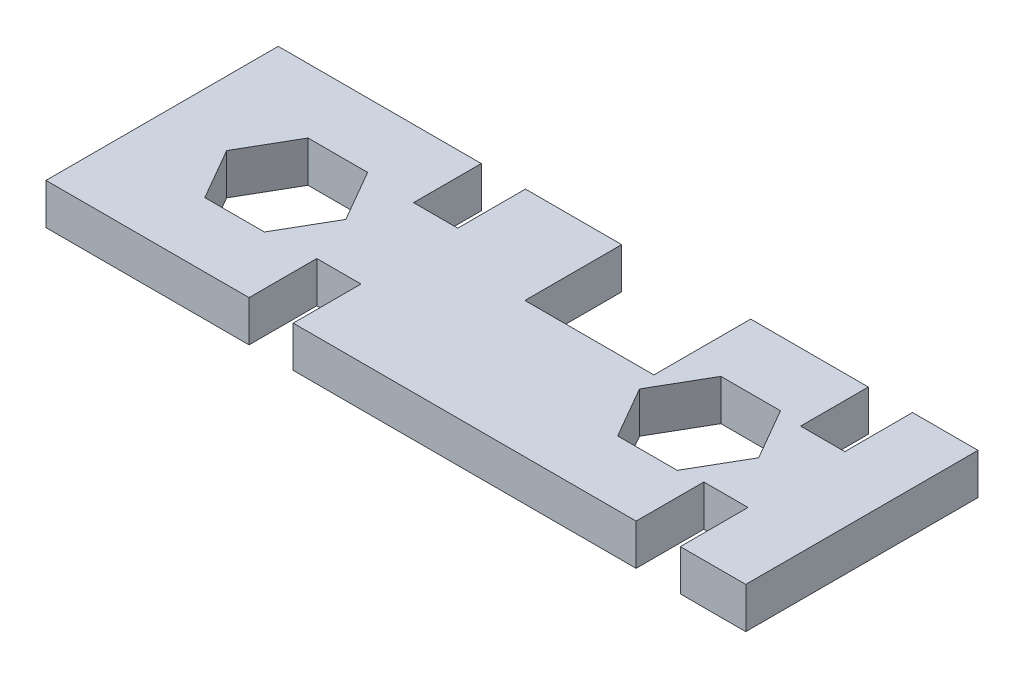
ISO-10303-21;
HEADER;
FILE_DESCRIPTION(('STEP AP214'),'2;1');
FILE_NAME('part.step','',(''),(''),'','','');
FILE_SCHEMA(('AUTOMOTIVE_DESIGN { 1 0 10303 214 1 1 1 1 }'));
ENDSEC;
DATA;
#1=APPLICATION_CONTEXT('core data for automotive mechanical design processes');
#2=APPLICATION_PROTOCOL_DEFINITION('international standard','automotive_design',2000,#1);
#3=PRODUCT_CONTEXT('',#1,'mechanical');
#4=PRODUCT('Part','Part','',(#3));
#5=PRODUCT_RELATED_PRODUCT_CATEGORY('part','',(#4));
#6=PRODUCT_DEFINITION_FORMATION('','',#4);
#7=PRODUCT_DEFINITION_CONTEXT('part definition',#1,'design');
#8=PRODUCT_DEFINITION('design','',#6,#7);
#9=PRODUCT_DEFINITION_SHAPE('','',#8);
#10=(LENGTH_UNIT() NAMED_UNIT(*) SI_UNIT(.MILLI.,.METRE.));
#11=(NAMED_UNIT(*) PLANE_ANGLE_UNIT() SI_UNIT($,.RADIAN.));
#12=(NAMED_UNIT(*) SI_UNIT($,.STERADIAN.) SOLID_ANGLE_UNIT());
#13=UNCERTAINTY_MEASURE_WITH_UNIT(LENGTH_MEASURE(1.E-05),#10,'distance_accuracy_value','');
#14=(GEOMETRIC_REPRESENTATION_CONTEXT(3) GLOBAL_UNCERTAINTY_ASSIGNED_CONTEXT((#13)) GLOBAL_UNIT_ASSIGNED_CONTEXT((#10,
#11,#12)) REPRESENTATION_CONTEXT('',''));
#15=CARTESIAN_POINT('',(0.,0.,0.));
#16=DIRECTION('',(0.,0.,1.));
#17=DIRECTION('',(1.,0.,0.));
#18=AXIS2_PLACEMENT_3D('',#15,#16,#17);
#19=CARTESIAN_POINT('',(-51.237604307034,3.175,-18.));
#20=DIRECTION('',(0.,0.,1.));
#21=DIRECTION('',(1.,0.,0.));
#22=AXIS2_PLACEMENT_3D('',#19,#20,#21);
#23=PLANE('',#22);
#24=DIRECTION('',(-1.,0.,0.));
#25=VECTOR('',#24,1.);
#26=CARTESIAN_POINT('',(-51.237604307034,3.175,-18.));
#27=LINE('',#26,#25);
#28=CARTESIAN_POINT('',(2.00239569296599,3.175,-18.));
#29=VERTEX_POINT('',#28);
#30=CARTESIAN_POINT('',(-12.912395692966,3.175,-18.));
#31=VERTEX_POINT('',#30);
#32=EDGE_CURVE('E631',#29,#31,#27,.T.);
#33=ORIENTED_EDGE('',*,*,#32,.F.);
#34=DIRECTION('',(0.,1.,0.));
#35=VECTOR('',#34,1.);
#36=CARTESIAN_POINT('',(2.00239569296599,-3.175,-18.));
#37=LINE('',#36,#35);
#38=CARTESIAN_POINT('',(2.00239569296599,-3.175,-18.));
#39=VERTEX_POINT('',#38);
#40=EDGE_CURVE('E405',#39,#29,#37,.T.);
#41=ORIENTED_EDGE('',*,*,#40,.F.);
#42=DIRECTION('',(-1.,0.,0.));
#43=VECTOR('',#42,1.);
#44=CARTESIAN_POINT('',(-51.237604307034,-3.175,-18.));
#45=LINE('',#44,#43);
#46=CARTESIAN_POINT('',(-12.912395692966,-3.175,-18.));
#47=VERTEX_POINT('',#46);
#48=EDGE_CURVE('E641',#39,#47,#45,.T.);
#49=ORIENTED_EDGE('',*,*,#48,.T.);
#50=DIRECTION('',(0.,1.,0.));
#51=VECTOR('',#50,1.);
#52=CARTESIAN_POINT('',(-12.912395692966,-3.175,-18.));
#53=LINE('',#52,#51);
#54=EDGE_CURVE('E482',#47,#31,#53,.T.);
#55=ORIENTED_EDGE('',*,*,#54,.T.);
#56=EDGE_LOOP('',(#33,#41,#49,#55));
#57=FACE_BOUND('',#56,.T.);
#58=ADVANCED_FACE('F38',(#57),#23,.F.);
#59=CARTESIAN_POINT('',(40.237604307034,-3.175,-18.));
#60=VERTEX_POINT('',#59);
#61=CARTESIAN_POINT('',(21.997604307034,-3.175,-18.));
#62=VERTEX_POINT('',#61);
#63=EDGE_CURVE('E640',#60,#62,#45,.T.);
#64=ORIENTED_EDGE('',*,*,#63,.T.);
#65=DIRECTION('',(0.,1.,0.));
#66=VECTOR('',#65,1.);
#67=CARTESIAN_POINT('',(21.997604307034,-3.175,-18.));
#68=LINE('',#67,#66);
#69=CARTESIAN_POINT('',(21.997604307034,3.175,-18.));
#70=VERTEX_POINT('',#69);
#71=EDGE_CURVE('E409',#62,#70,#68,.T.);
#72=ORIENTED_EDGE('',*,*,#71,.T.);
#73=CARTESIAN_POINT('',(40.237604307034,3.175,-18.));
#74=VERTEX_POINT('',#73);
#75=EDGE_CURVE('E630',#74,#70,#27,.T.);
#76=ORIENTED_EDGE('',*,*,#75,.F.);
#77=DIRECTION('',(0.,1.,0.));
#78=VECTOR('',#77,1.);
#79=CARTESIAN_POINT('',(40.237604307034,-3.175,-18.));
#80=LINE('',#79,#78);
#81=EDGE_CURVE('E441',#60,#74,#80,.T.);
#82=ORIENTED_EDGE('',*,*,#81,.F.);
#83=EDGE_LOOP('',(#64,#72,#76,#82));
#84=FACE_BOUND('',#83,.T.);
#85=ADVANCED_FACE('F675',(#84),#23,.F.);
#86=CARTESIAN_POINT('',(-19.762395692966,3.175,-18.));
#87=VERTEX_POINT('',#86);
#88=CARTESIAN_POINT('',(-51.237604307034,3.175,-18.));
#89=VERTEX_POINT('',#88);
#90=EDGE_CURVE('E625',#87,#89,#27,.T.);
#91=ORIENTED_EDGE('',*,*,#90,.F.);
#92=DIRECTION('',(0.,1.,0.));
#93=VECTOR('',#92,1.);
#94=CARTESIAN_POINT('',(-19.762395692966,-3.175,-18.));
#95=LINE('',#94,#93);
#96=CARTESIAN_POINT('',(-19.762395692966,-3.175,-18.));
#97=VERTEX_POINT('',#96);
#98=EDGE_CURVE('E478',#97,#87,#95,.T.);
#99=ORIENTED_EDGE('',*,*,#98,.F.);
#100=CARTESIAN_POINT('',(-51.237604307034,-3.175,-18.));
#101=VERTEX_POINT('',#100);
#102=EDGE_CURVE('E637',#97,#101,#45,.T.);
#103=ORIENTED_EDGE('',*,*,#102,.T.);
#104=DIRECTION('',(0.,-1.,0.));
#105=VECTOR('',#104,1.);
#106=CARTESIAN_POINT('',(-51.237604307034,3.175,-18.));
#107=LINE('',#106,#105);
#108=EDGE_CURVE('E47',#89,#101,#107,.T.);
#109=ORIENTED_EDGE('',*,*,#108,.F.);
#110=EDGE_LOOP('',(#91,#99,#103,#109));
#111=FACE_BOUND('',#110,.T.);
#112=ADVANCED_FACE('F697',(#111),#23,.F.);
#113=CARTESIAN_POINT('',(0.,3.175,0.));
#114=DIRECTION('',(0.,1.,0.));
#115=DIRECTION('',(0.,0.,1.));
#116=AXIS2_PLACEMENT_3D('',#113,#114,#115);
#117=PLANE('',#116);
#118=DIRECTION('',(-1.,0.,0.));
#119=VECTOR('',#118,1.);
#120=CARTESIAN_POINT('',(-51.237604307034,3.175,18.));
#121=LINE('',#120,#119);
#122=CARTESIAN_POINT('',(-19.762395692966,3.175,18.));
#123=VERTEX_POINT('',#122);
#124=CARTESIAN_POINT('',(-51.237604307034,3.175,18.));
#125=VERTEX_POINT('',#124);
#126=EDGE_CURVE('E298',#123,#125,#121,.T.);
#127=ORIENTED_EDGE('',*,*,#126,.F.);
#128=DIRECTION('',(0.,0.,1.));
#129=VECTOR('',#128,1.);
#130=CARTESIAN_POINT('',(-19.762395692966,3.175,18.));
#131=LINE('',#130,#129);
#132=CARTESIAN_POINT('',(-19.762395692966,3.175,7.50000000000002));
#133=VERTEX_POINT('',#132);
#134=EDGE_CURVE('E301',#133,#123,#131,.T.);
#135=ORIENTED_EDGE('',*,*,#134,.F.);
#136=DIRECTION('',(-1.,0.,0.));
#137=VECTOR('',#136,1.);
#138=CARTESIAN_POINT('',(-19.762395692966,3.175,7.50000000000002));
#139=LINE('',#138,#137);
#140=CARTESIAN_POINT('',(-12.912395692966,3.175,7.50000000000002));
#141=VERTEX_POINT('',#140);
#142=EDGE_CURVE('E350',#141,#133,#139,.T.);
#143=ORIENTED_EDGE('',*,*,#142,.F.);
#144=DIRECTION('',(0.,0.,-1.));
#145=VECTOR('',#144,1.);
#146=CARTESIAN_POINT('',(-12.912395692966,3.175,18.));
#147=LINE('',#146,#145);
#148=CARTESIAN_POINT('',(-12.912395692966,3.175,18.));
#149=VERTEX_POINT('',#148);
#150=EDGE_CURVE('E346',#149,#141,#147,.T.);
#151=ORIENTED_EDGE('',*,*,#150,.F.);
#152=DIRECTION('',(-1.,0.,0.));
#153=VECTOR('',#152,1.);
#154=CARTESIAN_POINT('',(-12.912395692966,3.175,18.));
#155=LINE('',#154,#153);
#156=CARTESIAN_POINT('',(40.237604307034,3.175,18.));
#157=VERTEX_POINT('',#156);
#158=EDGE_CURVE('E342',#157,#149,#155,.T.);
#159=ORIENTED_EDGE('',*,*,#158,.F.);
#160=DIRECTION('',(0.,0.,1.));
#161=VECTOR('',#160,1.);
#162=CARTESIAN_POINT('',(40.237604307034,3.175,18.));
#163=LINE('',#162,#161);
#164=CARTESIAN_POINT('',(40.237604307034,3.175,7.50000000000002));
#165=VERTEX_POINT('',#164);
#166=EDGE_CURVE('E338',#165,#157,#163,.T.);
#167=ORIENTED_EDGE('',*,*,#166,.F.);
#168=DIRECTION('',(-1.,0.,0.));
#169=VECTOR('',#168,1.);
#170=CARTESIAN_POINT('',(40.237604307034,3.175,7.50000000000002));
#171=LINE('',#170,#169);
#172=CARTESIAN_POINT('',(47.087604307034,3.175,7.50000000000002));
#173=VERTEX_POINT('',#172);
#174=EDGE_CURVE('E334',#173,#165,#171,.T.);
#175=ORIENTED_EDGE('',*,*,#174,.F.);
#176=DIRECTION('',(0.,0.,-1.));
#177=VECTOR('',#176,1.);
#178=CARTESIAN_POINT('',(47.087604307034,3.175,18.));
#179=LINE('',#178,#177);
#180=CARTESIAN_POINT('',(47.087604307034,3.175,18.));
#181=VERTEX_POINT('',#180);
#182=EDGE_CURVE('E331',#181,#173,#179,.T.);
#183=ORIENTED_EDGE('',*,*,#182,.F.);
#184=DIRECTION('',(-1.,0.,0.));
#185=VECTOR('',#184,1.);
#186=CARTESIAN_POINT('',(47.087604307034,3.175,18.));
#187=LINE('',#186,#185);
#188=CARTESIAN_POINT('',(57.237604307034,3.175,18.));
#189=VERTEX_POINT('',#188);
#190=EDGE_CURVE('E274',#189,#181,#187,.T.);
#191=ORIENTED_EDGE('',*,*,#190,.F.);
#192=DIRECTION('',(0.,0.,-1.));
#193=VECTOR('',#192,1.);
#194=CARTESIAN_POINT('',(57.237604307034,3.175,-18.));
#195=LINE('',#194,#193);
#196=CARTESIAN_POINT('',(57.237604307034,3.175,-18.));
#197=VERTEX_POINT('',#196);
#198=EDGE_CURVE('E621',#189,#197,#195,.T.);
#199=ORIENTED_EDGE('',*,*,#198,.T.);
#200=CARTESIAN_POINT('',(47.087604307034,3.175,-18.));
#201=VERTEX_POINT('',#200);
#202=EDGE_CURVE('E626',#197,#201,#27,.T.);
#203=ORIENTED_EDGE('',*,*,#202,.T.);
#204=DIRECTION('',(0.,0.,-1.));
#205=VECTOR('',#204,1.);
#206=CARTESIAN_POINT('',(47.087604307034,3.175,-18.));
#207=LINE('',#206,#205);
#208=CARTESIAN_POINT('',(47.087604307034,3.175,-7.49999999999998));
#209=VERTEX_POINT('',#208);
#210=EDGE_CURVE('E423',#209,#201,#207,.T.);
#211=ORIENTED_EDGE('',*,*,#210,.F.);
#212=DIRECTION('',(1.,0.,0.));
#213=VECTOR('',#212,1.);
#214=CARTESIAN_POINT('',(40.237604307034,3.175,-7.49999999999998));
#215=LINE('',#214,#213);
#216=CARTESIAN_POINT('',(40.237604307034,3.175,-7.49999999999998));
#217=VERTEX_POINT('',#216);
#218=EDGE_CURVE('E435',#217,#209,#215,.T.);
#219=ORIENTED_EDGE('',*,*,#218,.F.);
#220=DIRECTION('',(0.,0.,1.));
#221=VECTOR('',#220,1.);
#222=CARTESIAN_POINT('',(40.237604307034,3.175,-18.));
#223=LINE('',#222,#221);
#224=EDGE_CURVE('E408',#74,#217,#223,.T.);
#225=ORIENTED_EDGE('',*,*,#224,.F.);
#226=ORIENTED_EDGE('',*,*,#75,.T.);
#227=DIRECTION('',(0.,0.,-1.));
#228=VECTOR('',#227,1.);
#229=CARTESIAN_POINT('',(21.997604307034,3.175,-18.));
#230=LINE('',#229,#228);
#231=CARTESIAN_POINT('',(21.997604307034,3.175,-2.99999999999998));
#232=VERTEX_POINT('',#231);
#233=EDGE_CURVE('E389',#232,#70,#230,.T.);
#234=ORIENTED_EDGE('',*,*,#233,.F.);
#235=DIRECTION('',(1.,0.,0.));
#236=VECTOR('',#235,1.);
#237=CARTESIAN_POINT('',(2.002395692966,3.175,-2.99999999999998));
#238=LINE('',#237,#236);
#239=CARTESIAN_POINT('',(2.002395692966,3.175,-2.99999999999998));
#240=VERTEX_POINT('',#239);
#241=EDGE_CURVE('E399',#240,#232,#238,.T.);
#242=ORIENTED_EDGE('',*,*,#241,.F.);
#243=DIRECTION('',(0.,0.,1.));
#244=VECTOR('',#243,1.);
#245=CARTESIAN_POINT('',(2.00239569296599,3.175,-18.));
#246=LINE('',#245,#244);
#247=EDGE_CURVE('E361',#29,#240,#246,.T.);
#248=ORIENTED_EDGE('',*,*,#247,.F.);
#249=ORIENTED_EDGE('',*,*,#32,.T.);
#250=DIRECTION('',(0.,0.,-1.));
#251=VECTOR('',#250,1.);
#252=CARTESIAN_POINT('',(-12.912395692966,3.175,-18.));
#253=LINE('',#252,#251);
#254=CARTESIAN_POINT('',(-12.912395692966,3.175,-7.49999999999998));
#255=VERTEX_POINT('',#254);
#256=EDGE_CURVE('E459',#255,#31,#253,.T.);
#257=ORIENTED_EDGE('',*,*,#256,.F.);
#258=DIRECTION('',(1.,0.,0.));
#259=VECTOR('',#258,1.);
#260=CARTESIAN_POINT('',(-19.762395692966,3.175,-7.49999999999998));
#261=LINE('',#260,#259);
#262=CARTESIAN_POINT('',(-19.762395692966,3.175,-7.49999999999998));
#263=VERTEX_POINT('',#262);
#264=EDGE_CURVE('E471',#263,#255,#261,.T.);
#265=ORIENTED_EDGE('',*,*,#264,.F.);
#266=DIRECTION('',(0.,0.,1.));
#267=VECTOR('',#266,1.);
#268=CARTESIAN_POINT('',(-19.762395692966,3.175,-18.));
#269=LINE('',#268,#267);
#270=EDGE_CURVE('E444',#87,#263,#269,.T.);
#271=ORIENTED_EDGE('',*,*,#270,.F.);
#272=ORIENTED_EDGE('',*,*,#90,.T.);
#273=DIRECTION('',(0.,0.,1.));
#274=VECTOR('',#273,1.);
#275=CARTESIAN_POINT('',(-51.237604307034,3.175,-18.));
#276=LINE('',#275,#274);
#277=EDGE_CURVE('E617',#89,#125,#276,.T.);
#278=ORIENTED_EDGE('',*,*,#277,.T.);
#279=EDGE_LOOP('',(#127,#135,#143,#151,#159,#167,#175,#183,#191,#199,#203,#211,#219,#225,#226,
#234,#242,#248,#249,#257,#265,#271,#272,#278));
#280=FACE_BOUND('',#279,.T.);
#281=DIRECTION('',(-0.499999999999999,0.,-0.866025403784439));
#282=VECTOR('',#281,1.);
#283=CARTESIAN_POINT('',(-22.762395692966,3.175,0.));
#284=LINE('',#283,#282);
#285=CARTESIAN_POINT('',(-22.762395692966,3.175,0.));
#286=VERTEX_POINT('',#285);
#287=CARTESIAN_POINT('',(-27.381197846483,3.175,-7.99999999999998));
#288=VERTEX_POINT('',#287);
#289=EDGE_CURVE('E557',#286,#288,#284,.T.);
#290=ORIENTED_EDGE('',*,*,#289,.F.);
#291=DIRECTION('',(0.5,0.,-0.866025403784439));
#292=VECTOR('',#291,1.);
#293=CARTESIAN_POINT('',(-27.381197846483,3.175,8.00000000000002));
#294=LINE('',#293,#292);
#295=CARTESIAN_POINT('',(-27.381197846483,3.175,8.00000000000002));
#296=VERTEX_POINT('',#295);
#297=EDGE_CURVE('E554',#296,#286,#294,.T.);
#298=ORIENTED_EDGE('',*,*,#297,.F.);
#299=DIRECTION('',(1.,0.,0.));
#300=VECTOR('',#299,1.);
#301=CARTESIAN_POINT('',(-36.618802153517,3.175,8.00000000000002));
#302=LINE('',#301,#300);
#303=CARTESIAN_POINT('',(-36.618802153517,3.175,8.00000000000002));
#304=VERTEX_POINT('',#303);
#305=EDGE_CURVE('E571',#304,#296,#302,.T.);
#306=ORIENTED_EDGE('',*,*,#305,.F.);
#307=DIRECTION('',(0.5,0.,0.866025403784438));
#308=VECTOR('',#307,1.);
#309=CARTESIAN_POINT('',(-41.237604307034,3.175,0.));
#310=LINE('',#309,#308);
#311=CARTESIAN_POINT('',(-41.237604307034,3.175,0.));
#312=VERTEX_POINT('',#311);
#313=EDGE_CURVE('E567',#312,#304,#310,.T.);
#314=ORIENTED_EDGE('',*,*,#313,.F.);
#315=DIRECTION('',(-0.5,0.,0.866025403784438));
#316=VECTOR('',#315,1.);
#317=CARTESIAN_POINT('',(-36.618802153517,3.175,-7.99999999999998));
#318=LINE('',#317,#316);
#319=CARTESIAN_POINT('',(-36.618802153517,3.175,-7.99999999999998));
#320=VERTEX_POINT('',#319);
#321=EDGE_CURVE('E564',#320,#312,#318,.T.);
#322=ORIENTED_EDGE('',*,*,#321,.F.);
#323=DIRECTION('',(-1.,0.,0.));
#324=VECTOR('',#323,1.);
#325=CARTESIAN_POINT('',(-27.381197846483,3.175,-7.99999999999998));
#326=LINE('',#325,#324);
#327=EDGE_CURVE('E561',#288,#320,#326,.T.);
#328=ORIENTED_EDGE('',*,*,#327,.F.);
#329=EDGE_LOOP('',(#290,#298,#306,#314,#322,#328));
#330=FACE_BOUND('',#329,.T.);
#331=DIRECTION('',(-0.5,0.,-0.866025403784439));
#332=VECTOR('',#331,1.);
#333=CARTESIAN_POINT('',(41.237604307034,3.175,0.));
#334=LINE('',#333,#332);
#335=CARTESIAN_POINT('',(41.237604307034,3.175,0.));
#336=VERTEX_POINT('',#335);
#337=CARTESIAN_POINT('',(36.618802153517,3.175,-7.99999999999999));
#338=VERTEX_POINT('',#337);
#339=EDGE_CURVE('E494',#336,#338,#334,.T.);
#340=ORIENTED_EDGE('',*,*,#339,.F.);
#341=DIRECTION('',(0.5,0.,-0.866025403784439));
#342=VECTOR('',#341,1.);
#343=CARTESIAN_POINT('',(36.618802153517,3.175,8.00000000000001));
#344=LINE('',#343,#342);
#345=CARTESIAN_POINT('',(36.618802153517,3.175,8.00000000000001));
#346=VERTEX_POINT('',#345);
#347=EDGE_CURVE('E491',#346,#336,#344,.T.);
#348=ORIENTED_EDGE('',*,*,#347,.F.);
#349=DIRECTION('',(1.,0.,0.));
#350=VECTOR('',#349,1.);
#351=CARTESIAN_POINT('',(27.381197846483,3.175,8.00000000000001));
#352=LINE('',#351,#350);
#353=CARTESIAN_POINT('',(27.381197846483,3.175,8.00000000000001));
#354=VERTEX_POINT('',#353);
#355=EDGE_CURVE('E508',#354,#346,#352,.T.);
#356=ORIENTED_EDGE('',*,*,#355,.F.);
#357=DIRECTION('',(0.5,0.,0.866025403784438));
#358=VECTOR('',#357,1.);
#359=CARTESIAN_POINT('',(22.762395692966,3.175,0.));
#360=LINE('',#359,#358);
#361=CARTESIAN_POINT('',(22.762395692966,3.175,0.));
#362=VERTEX_POINT('',#361);
#363=EDGE_CURVE('E504',#362,#354,#360,.T.);
#364=ORIENTED_EDGE('',*,*,#363,.F.);
#365=DIRECTION('',(-0.5,0.,0.866025403784438));
#366=VECTOR('',#365,1.);
#367=CARTESIAN_POINT('',(27.381197846483,3.175,-7.99999999999999));
#368=LINE('',#367,#366);
#369=CARTESIAN_POINT('',(27.381197846483,3.175,-7.99999999999999));
#370=VERTEX_POINT('',#369);
#371=EDGE_CURVE('E501',#370,#362,#368,.T.);
#372=ORIENTED_EDGE('',*,*,#371,.F.);
#373=DIRECTION('',(-1.,0.,0.));
#374=VECTOR('',#373,1.);
#375=CARTESIAN_POINT('',(36.618802153517,3.175,-7.99999999999999));
#376=LINE('',#375,#374);
#377=EDGE_CURVE('E498',#338,#370,#376,.T.);
#378=ORIENTED_EDGE('',*,*,#377,.F.);
#379=EDGE_LOOP('',(#340,#348,#356,#364,#372,#378));
#380=FACE_BOUND('',#379,.T.);
#381=ADVANCED_FACE('F657',(#280,#330,#380),#117,.T.);
#382=CARTESIAN_POINT('',(0.,-3.175,0.));
#383=DIRECTION('',(0.,1.,0.));
#384=DIRECTION('',(0.,0.,1.));
#385=AXIS2_PLACEMENT_3D('',#382,#383,#384);
#386=PLANE('',#385);
#387=DIRECTION('',(0.,0.,1.));
#388=VECTOR('',#387,1.);
#389=CARTESIAN_POINT('',(-19.762395692966,-3.175,18.));
#390=LINE('',#389,#388);
#391=CARTESIAN_POINT('',(-19.762395692966,-3.175,7.50000000000002));
#392=VERTEX_POINT('',#391);
#393=CARTESIAN_POINT('',(-19.762395692966,-3.175,18.));
#394=VERTEX_POINT('',#393);
#395=EDGE_CURVE('E322',#392,#394,#390,.T.);
#396=ORIENTED_EDGE('',*,*,#395,.T.);
#397=DIRECTION('',(-1.,0.,0.));
#398=VECTOR('',#397,1.);
#399=CARTESIAN_POINT('',(-51.237604307034,-3.175,18.));
#400=LINE('',#399,#398);
#401=CARTESIAN_POINT('',(-51.237604307034,-3.175,18.));
#402=VERTEX_POINT('',#401);
#403=EDGE_CURVE('E325',#394,#402,#400,.T.);
#404=ORIENTED_EDGE('',*,*,#403,.T.);
#405=DIRECTION('',(0.,0.,1.));
#406=VECTOR('',#405,1.);
#407=CARTESIAN_POINT('',(-51.237604307034,-3.175,-18.));
#408=LINE('',#407,#406);
#409=EDGE_CURVE('E616',#101,#402,#408,.T.);
#410=ORIENTED_EDGE('',*,*,#409,.F.);
#411=ORIENTED_EDGE('',*,*,#102,.F.);
#412=DIRECTION('',(0.,0.,1.));
#413=VECTOR('',#412,1.);
#414=CARTESIAN_POINT('',(-19.762395692966,-3.175,-18.));
#415=LINE('',#414,#413);
#416=CARTESIAN_POINT('',(-19.762395692966,-3.175,-7.49999999999998));
#417=VERTEX_POINT('',#416);
#418=EDGE_CURVE('E454',#97,#417,#415,.T.);
#419=ORIENTED_EDGE('',*,*,#418,.T.);
#420=DIRECTION('',(1.,0.,0.));
#421=VECTOR('',#420,1.);
#422=CARTESIAN_POINT('',(-19.762395692966,-3.175,-7.49999999999998));
#423=LINE('',#422,#421);
#424=CARTESIAN_POINT('',(-12.912395692966,-3.175,-7.49999999999998));
#425=VERTEX_POINT('',#424);
#426=EDGE_CURVE('E458',#417,#425,#423,.T.);
#427=ORIENTED_EDGE('',*,*,#426,.T.);
#428=DIRECTION('',(0.,0.,-1.));
#429=VECTOR('',#428,1.);
#430=CARTESIAN_POINT('',(-12.912395692966,-3.175,-18.));
#431=LINE('',#430,#429);
#432=EDGE_CURVE('E463',#425,#47,#431,.T.);
#433=ORIENTED_EDGE('',*,*,#432,.T.);
#434=ORIENTED_EDGE('',*,*,#48,.F.);
#435=DIRECTION('',(0.,0.,1.));
#436=VECTOR('',#435,1.);
#437=CARTESIAN_POINT('',(2.00239569296599,-3.175,-18.));
#438=LINE('',#437,#436);
#439=CARTESIAN_POINT('',(2.002395692966,-3.175,-2.99999999999998));
#440=VERTEX_POINT('',#439);
#441=EDGE_CURVE('E384',#39,#440,#438,.T.);
#442=ORIENTED_EDGE('',*,*,#441,.T.);
#443=DIRECTION('',(1.,0.,0.));
#444=VECTOR('',#443,1.);
#445=CARTESIAN_POINT('',(2.002395692966,-3.175,-2.99999999999998));
#446=LINE('',#445,#444);
#447=CARTESIAN_POINT('',(21.997604307034,-3.175,-2.99999999999998));
#448=VERTEX_POINT('',#447);
#449=EDGE_CURVE('E388',#440,#448,#446,.T.);
#450=ORIENTED_EDGE('',*,*,#449,.T.);
#451=DIRECTION('',(0.,0.,-1.));
#452=VECTOR('',#451,1.);
#453=CARTESIAN_POINT('',(21.997604307034,-3.175,-18.));
#454=LINE('',#453,#452);
#455=EDGE_CURVE('E62',#448,#62,#454,.T.);
#456=ORIENTED_EDGE('',*,*,#455,.T.);
#457=ORIENTED_EDGE('',*,*,#63,.F.);
#458=DIRECTION('',(0.,0.,1.));
#459=VECTOR('',#458,1.);
#460=CARTESIAN_POINT('',(40.237604307034,-3.175,-18.));
#461=LINE('',#460,#459);
#462=CARTESIAN_POINT('',(40.237604307034,-3.175,-7.49999999999998));
#463=VERTEX_POINT('',#462);
#464=EDGE_CURVE('E418',#60,#463,#461,.T.);
#465=ORIENTED_EDGE('',*,*,#464,.T.);
#466=DIRECTION('',(1.,0.,0.));
#467=VECTOR('',#466,1.);
#468=CARTESIAN_POINT('',(40.237604307034,-3.175,-7.49999999999998));
#469=LINE('',#468,#467);
#470=CARTESIAN_POINT('',(47.087604307034,-3.175,-7.49999999999998));
#471=VERTEX_POINT('',#470);
#472=EDGE_CURVE('E422',#463,#471,#469,.T.);
#473=ORIENTED_EDGE('',*,*,#472,.T.);
#474=DIRECTION('',(0.,0.,-1.));
#475=VECTOR('',#474,1.);
#476=CARTESIAN_POINT('',(47.087604307034,-3.175,-18.));
#477=LINE('',#476,#475);
#478=CARTESIAN_POINT('',(47.087604307034,-3.175,-18.));
#479=VERTEX_POINT('',#478);
#480=EDGE_CURVE('E427',#471,#479,#477,.T.);
#481=ORIENTED_EDGE('',*,*,#480,.T.);
#482=CARTESIAN_POINT('',(57.237604307034,-3.175,-18.));
#483=VERTEX_POINT('',#482);
#484=EDGE_CURVE('E622',#483,#479,#45,.T.);
#485=ORIENTED_EDGE('',*,*,#484,.F.);
#486=DIRECTION('',(0.,0.,-1.));
#487=VECTOR('',#486,1.);
#488=CARTESIAN_POINT('',(57.237604307034,-3.175,-18.));
#489=LINE('',#488,#487);
#490=CARTESIAN_POINT('',(57.237604307034,-3.175,18.));
#491=VERTEX_POINT('',#490);
#492=EDGE_CURVE('E296',#491,#483,#489,.T.);
#493=ORIENTED_EDGE('',*,*,#492,.F.);
#494=DIRECTION('',(-1.,0.,0.));
#495=VECTOR('',#494,1.);
#496=CARTESIAN_POINT('',(47.087604307034,-3.175,18.));
#497=LINE('',#496,#495);
#498=CARTESIAN_POINT('',(47.087604307034,-3.175,18.));
#499=VERTEX_POINT('',#498);
#500=EDGE_CURVE('E54',#491,#499,#497,.T.);
#501=ORIENTED_EDGE('',*,*,#500,.T.);
#502=DIRECTION('',(0.,0.,-1.));
#503=VECTOR('',#502,1.);
#504=CARTESIAN_POINT('',(47.087604307034,-3.175,18.));
#505=LINE('',#504,#503);
#506=CARTESIAN_POINT('',(47.087604307034,-3.175,7.50000000000002));
#507=VERTEX_POINT('',#506);
#508=EDGE_CURVE('E283',#499,#507,#505,.T.);
#509=ORIENTED_EDGE('',*,*,#508,.T.);
#510=DIRECTION('',(-1.,0.,0.));
#511=VECTOR('',#510,1.);
#512=CARTESIAN_POINT('',(40.237604307034,-3.175,7.50000000000002));
#513=LINE('',#512,#511);
#514=CARTESIAN_POINT('',(40.237604307034,-3.175,7.50000000000002));
#515=VERTEX_POINT('',#514);
#516=EDGE_CURVE('E289',#507,#515,#513,.T.);
#517=ORIENTED_EDGE('',*,*,#516,.T.);
#518=DIRECTION('',(0.,0.,1.));
#519=VECTOR('',#518,1.);
#520=CARTESIAN_POINT('',(40.237604307034,-3.175,18.));
#521=LINE('',#520,#519);
#522=CARTESIAN_POINT('',(40.237604307034,-3.175,18.));
#523=VERTEX_POINT('',#522);
#524=EDGE_CURVE('E306',#515,#523,#521,.T.);
#525=ORIENTED_EDGE('',*,*,#524,.T.);
#526=DIRECTION('',(-1.,0.,0.));
#527=VECTOR('',#526,1.);
#528=CARTESIAN_POINT('',(-12.912395692966,-3.175,18.));
#529=LINE('',#528,#527);
#530=CARTESIAN_POINT('',(-12.912395692966,-3.175,18.));
#531=VERTEX_POINT('',#530);
#532=EDGE_CURVE('E310',#523,#531,#529,.T.);
#533=ORIENTED_EDGE('',*,*,#532,.T.);
#534=DIRECTION('',(0.,0.,-1.));
#535=VECTOR('',#534,1.);
#536=CARTESIAN_POINT('',(-12.912395692966,-3.175,18.));
#537=LINE('',#536,#535);
#538=CARTESIAN_POINT('',(-12.912395692966,-3.175,7.50000000000002));
#539=VERTEX_POINT('',#538);
#540=EDGE_CURVE('E314',#531,#539,#537,.T.);
#541=ORIENTED_EDGE('',*,*,#540,.T.);
#542=DIRECTION('',(-1.,0.,0.));
#543=VECTOR('',#542,1.);
#544=CARTESIAN_POINT('',(-19.762395692966,-3.175,7.50000000000002));
#545=LINE('',#544,#543);
#546=EDGE_CURVE('E318',#539,#392,#545,.T.);
#547=ORIENTED_EDGE('',*,*,#546,.T.);
#548=EDGE_LOOP('',(#396,#404,#410,#411,#419,#427,#433,#434,#442,#450,#456,#457,#465,#473,#481,
#485,#493,#501,#509,#517,#525,#533,#541,#547));
#549=FACE_BOUND('',#548,.T.);
#550=DIRECTION('',(0.5,0.,-0.866025403784439));
#551=VECTOR('',#550,1.);
#552=CARTESIAN_POINT('',(-27.381197846483,-3.175,8.00000000000002));
#553=LINE('',#552,#551);
#554=CARTESIAN_POINT('',(-27.381197846483,-3.175,8.00000000000002));
#555=VERTEX_POINT('',#554);
#556=CARTESIAN_POINT('',(-22.762395692966,-3.175,0.));
#557=VERTEX_POINT('',#556);
#558=EDGE_CURVE('E553',#555,#557,#553,.T.);
#559=ORIENTED_EDGE('',*,*,#558,.T.);
#560=DIRECTION('',(-0.499999999999999,0.,-0.866025403784439));
#561=VECTOR('',#560,1.);
#562=CARTESIAN_POINT('',(-22.762395692966,-3.175,0.));
#563=LINE('',#562,#561);
#564=CARTESIAN_POINT('',(-27.381197846483,-3.175,-7.99999999999998));
#565=VERTEX_POINT('',#564);
#566=EDGE_CURVE('E578',#557,#565,#563,.T.);
#567=ORIENTED_EDGE('',*,*,#566,.T.);
#568=DIRECTION('',(-1.,0.,0.));
#569=VECTOR('',#568,1.);
#570=CARTESIAN_POINT('',(-27.381197846483,-3.175,-7.99999999999998));
#571=LINE('',#570,#569);
#572=CARTESIAN_POINT('',(-36.618802153517,-3.175,-7.99999999999998));
#573=VERTEX_POINT('',#572);
#574=EDGE_CURVE('E582',#565,#573,#571,.T.);
#575=ORIENTED_EDGE('',*,*,#574,.T.);
#576=DIRECTION('',(-0.5,0.,0.866025403784438));
#577=VECTOR('',#576,1.);
#578=CARTESIAN_POINT('',(-36.618802153517,-3.175,-7.99999999999998));
#579=LINE('',#578,#577);
#580=CARTESIAN_POINT('',(-41.237604307034,-3.175,0.));
#581=VERTEX_POINT('',#580);
#582=EDGE_CURVE('E586',#573,#581,#579,.T.);
#583=ORIENTED_EDGE('',*,*,#582,.T.);
#584=DIRECTION('',(0.5,0.,0.866025403784438));
#585=VECTOR('',#584,1.);
#586=CARTESIAN_POINT('',(-41.237604307034,-3.175,0.));
#587=LINE('',#586,#585);
#588=CARTESIAN_POINT('',(-36.618802153517,-3.175,8.00000000000002));
#589=VERTEX_POINT('',#588);
#590=EDGE_CURVE('E590',#581,#589,#587,.T.);
#591=ORIENTED_EDGE('',*,*,#590,.T.);
#592=DIRECTION('',(1.,0.,0.));
#593=VECTOR('',#592,1.);
#594=CARTESIAN_POINT('',(-36.618802153517,-3.175,8.00000000000002));
#595=LINE('',#594,#593);
#596=EDGE_CURVE('E558',#589,#555,#595,.T.);
#597=ORIENTED_EDGE('',*,*,#596,.T.);
#598=EDGE_LOOP('',(#559,#567,#575,#583,#591,#597));
#599=FACE_BOUND('',#598,.T.);
#600=DIRECTION('',(0.5,0.,-0.866025403784439));
#601=VECTOR('',#600,1.);
#602=CARTESIAN_POINT('',(36.618802153517,-3.175,8.00000000000001));
#603=LINE('',#602,#601);
#604=CARTESIAN_POINT('',(36.618802153517,-3.175,8.00000000000001));
#605=VERTEX_POINT('',#604);
#606=CARTESIAN_POINT('',(41.237604307034,-3.175,0.));
#607=VERTEX_POINT('',#606);
#608=EDGE_CURVE('E481',#605,#607,#603,.T.);
#609=ORIENTED_EDGE('',*,*,#608,.T.);
#610=DIRECTION('',(-0.5,0.,-0.866025403784439));
#611=VECTOR('',#610,1.);
#612=CARTESIAN_POINT('',(41.237604307034,-3.175,0.));
#613=LINE('',#612,#611);
#614=CARTESIAN_POINT('',(36.618802153517,-3.175,-7.99999999999999));
#615=VERTEX_POINT('',#614);
#616=EDGE_CURVE('E515',#607,#615,#613,.T.);
#617=ORIENTED_EDGE('',*,*,#616,.T.);
#618=DIRECTION('',(-1.,0.,0.));
#619=VECTOR('',#618,1.);
#620=CARTESIAN_POINT('',(36.618802153517,-3.175,-7.99999999999999));
#621=LINE('',#620,#619);
#622=CARTESIAN_POINT('',(27.381197846483,-3.175,-7.99999999999999));
#623=VERTEX_POINT('',#622);
#624=EDGE_CURVE('E519',#615,#623,#621,.T.);
#625=ORIENTED_EDGE('',*,*,#624,.T.);
#626=DIRECTION('',(-0.5,0.,0.866025403784438));
#627=VECTOR('',#626,1.);
#628=CARTESIAN_POINT('',(27.381197846483,-3.175,-7.99999999999999));
#629=LINE('',#628,#627);
#630=CARTESIAN_POINT('',(22.762395692966,-3.175,0.));
#631=VERTEX_POINT('',#630);
#632=EDGE_CURVE('E523',#623,#631,#629,.T.);
#633=ORIENTED_EDGE('',*,*,#632,.T.);
#634=DIRECTION('',(0.5,0.,0.866025403784438));
#635=VECTOR('',#634,1.);
#636=CARTESIAN_POINT('',(22.762395692966,-3.175,0.));
#637=LINE('',#636,#635);
#638=CARTESIAN_POINT('',(27.381197846483,-3.175,8.00000000000001));
#639=VERTEX_POINT('',#638);
#640=EDGE_CURVE('E527',#631,#639,#637,.T.);
#641=ORIENTED_EDGE('',*,*,#640,.T.);
#642=DIRECTION('',(1.,0.,0.));
#643=VECTOR('',#642,1.);
#644=CARTESIAN_POINT('',(27.381197846483,-3.175,8.00000000000001));
#645=LINE('',#644,#643);
#646=EDGE_CURVE('E495',#639,#605,#645,.T.);
#647=ORIENTED_EDGE('',*,*,#646,.T.);
#648=EDGE_LOOP('',(#609,#617,#625,#633,#641,#647));
#649=FACE_BOUND('',#648,.T.);
#650=ADVANCED_FACE('F293',(#549,#599,#649),#386,.F.);
#651=CARTESIAN_POINT('',(-51.237604307034,3.175,-18.));
#652=DIRECTION('',(1.,0.,0.));
#653=DIRECTION('',(0.,0.,-1.));
#654=AXIS2_PLACEMENT_3D('',#651,#652,#653);
#655=PLANE('',#654);
#656=ORIENTED_EDGE('',*,*,#409,.T.);
#657=DIRECTION('',(0.,1.,0.));
#658=VECTOR('',#657,1.);
#659=CARTESIAN_POINT('',(-51.237604307034,-3.175,18.));
#660=LINE('',#659,#658);
#661=EDGE_CURVE('E357',#402,#125,#660,.T.);
#662=ORIENTED_EDGE('',*,*,#661,.T.);
#663=ORIENTED_EDGE('',*,*,#277,.F.);
#664=ORIENTED_EDGE('',*,*,#108,.T.);
#665=EDGE_LOOP('',(#656,#662,#663,#664));
#666=FACE_BOUND('',#665,.T.);
#667=ADVANCED_FACE('F40',(#666),#655,.F.);
#668=CARTESIAN_POINT('',(57.237604307034,3.175,-18.));
#669=DIRECTION('',(-1.,0.,0.));
#670=DIRECTION('',(0.,0.,1.));
#671=AXIS2_PLACEMENT_3D('',#668,#669,#670);
#672=PLANE('',#671);
#673=ORIENTED_EDGE('',*,*,#198,.F.);
#674=DIRECTION('',(0.,1.,0.));
#675=VECTOR('',#674,1.);
#676=CARTESIAN_POINT('',(57.237604307034,-3.175,18.));
#677=LINE('',#676,#675);
#678=EDGE_CURVE('E280',#491,#189,#677,.T.);
#679=ORIENTED_EDGE('',*,*,#678,.F.);
#680=ORIENTED_EDGE('',*,*,#492,.T.);
#681=DIRECTION('',(0.,-1.,0.));
#682=VECTOR('',#681,1.);
#683=CARTESIAN_POINT('',(57.237604307034,3.175,-18.));
#684=LINE('',#683,#682);
#685=EDGE_CURVE('E11',#197,#483,#684,.T.);
#686=ORIENTED_EDGE('',*,*,#685,.F.);
#687=EDGE_LOOP('',(#673,#679,#680,#686));
#688=FACE_BOUND('',#687,.T.);
#689=ADVANCED_FACE('F712',(#688),#672,.F.);
#690=ORIENTED_EDGE('',*,*,#484,.T.);
#691=DIRECTION('',(0.,1.,0.));
#692=VECTOR('',#691,1.);
#693=CARTESIAN_POINT('',(47.087604307034,-3.175,-18.));
#694=LINE('',#693,#692);
#695=EDGE_CURVE('E445',#479,#201,#694,.T.);
#696=ORIENTED_EDGE('',*,*,#695,.T.);
#697=ORIENTED_EDGE('',*,*,#202,.F.);
#698=ORIENTED_EDGE('',*,*,#685,.T.);
#699=EDGE_LOOP('',(#690,#696,#697,#698));
#700=FACE_BOUND('',#699,.T.);
#701=ADVANCED_FACE('F703',(#700),#23,.F.);
#702=CARTESIAN_POINT('',(-27.381197846483,3.175,8.00000000000002));
#703=DIRECTION('',(-0.866025403784439,0.,-0.5));
#704=DIRECTION('',(-0.5,0.,0.866025403784439));
#705=AXIS2_PLACEMENT_3D('',#702,#703,#704);
#706=PLANE('',#705);
#707=ORIENTED_EDGE('',*,*,#558,.F.);
#708=DIRECTION('',(0.,-1.,0.));
#709=VECTOR('',#708,1.);
#710=CARTESIAN_POINT('',(-27.381197846483,3.175,8.00000000000002));
#711=LINE('',#710,#709);
#712=EDGE_CURVE('E574',#296,#555,#711,.T.);
#713=ORIENTED_EDGE('',*,*,#712,.F.);
#714=ORIENTED_EDGE('',*,*,#297,.T.);
#715=DIRECTION('',(0.,-1.,0.));
#716=VECTOR('',#715,1.);
#717=CARTESIAN_POINT('',(-22.762395692966,3.175,0.));
#718=LINE('',#717,#716);
#719=EDGE_CURVE('E612',#286,#557,#718,.T.);
#720=ORIENTED_EDGE('',*,*,#719,.T.);
#721=EDGE_LOOP('',(#707,#713,#714,#720));
#722=FACE_BOUND('',#721,.T.);
#723=ADVANCED_FACE('F711',(#722),#706,.T.);
#724=CARTESIAN_POINT('',(-22.762395692966,3.175,0.));
#725=DIRECTION('',(-0.866025403784439,0.,0.499999999999999));
#726=DIRECTION('',(0.499999999999999,0.,0.866025403784439));
#727=AXIS2_PLACEMENT_3D('',#724,#725,#726);
#728=PLANE('',#727);
#729=ORIENTED_EDGE('',*,*,#566,.F.);
#730=ORIENTED_EDGE('',*,*,#719,.F.);
#731=ORIENTED_EDGE('',*,*,#289,.T.);
#732=DIRECTION('',(0.,-1.,0.));
#733=VECTOR('',#732,1.);
#734=CARTESIAN_POINT('',(-27.381197846483,3.175,-7.99999999999998));
#735=LINE('',#734,#733);
#736=EDGE_CURVE('E609',#288,#565,#735,.T.);
#737=ORIENTED_EDGE('',*,*,#736,.T.);
#738=EDGE_LOOP('',(#729,#730,#731,#737));
#739=FACE_BOUND('',#738,.T.);
#740=ADVANCED_FACE('F924',(#739),#728,.T.);
#741=CARTESIAN_POINT('',(-27.381197846483,3.175,-7.99999999999998));
#742=DIRECTION('',(0.,0.,1.));
#743=DIRECTION('',(1.,0.,0.));
#744=AXIS2_PLACEMENT_3D('',#741,#742,#743);
#745=PLANE('',#744);
#746=ORIENTED_EDGE('',*,*,#574,.F.);
#747=ORIENTED_EDGE('',*,*,#736,.F.);
#748=ORIENTED_EDGE('',*,*,#327,.T.);
#749=DIRECTION('',(0.,-1.,0.));
#750=VECTOR('',#749,1.);
#751=CARTESIAN_POINT('',(-36.618802153517,3.175,-7.99999999999998));
#752=LINE('',#751,#750);
#753=EDGE_CURVE('E606',#320,#573,#752,.T.);
#754=ORIENTED_EDGE('',*,*,#753,.T.);
#755=EDGE_LOOP('',(#746,#747,#748,#754));
#756=FACE_BOUND('',#755,.T.);
#757=ADVANCED_FACE('F920',(#756),#745,.T.);
#758=CARTESIAN_POINT('',(-36.618802153517,3.175,-7.99999999999998));
#759=DIRECTION('',(0.866025403784439,0.,0.5));
#760=DIRECTION('',(0.5,0.,-0.866025403784439));
#761=AXIS2_PLACEMENT_3D('',#758,#759,#760);
#762=PLANE('',#761);
#763=ORIENTED_EDGE('',*,*,#582,.F.);
#764=ORIENTED_EDGE('',*,*,#753,.F.);
#765=ORIENTED_EDGE('',*,*,#321,.T.);
#766=DIRECTION('',(0.,-1.,0.));
#767=VECTOR('',#766,1.);
#768=CARTESIAN_POINT('',(-41.237604307034,3.175,0.));
#769=LINE('',#768,#767);
#770=EDGE_CURVE('E603',#312,#581,#769,.T.);
#771=ORIENTED_EDGE('',*,*,#770,.T.);
#772=EDGE_LOOP('',(#763,#764,#765,#771));
#773=FACE_BOUND('',#772,.T.);
#774=ADVANCED_FACE('F916',(#773),#762,.T.);
#775=CARTESIAN_POINT('',(-41.237604307034,3.175,0.));
#776=DIRECTION('',(0.866025403784438,0.,-0.5));
#777=DIRECTION('',(-0.5,0.,-0.866025403784438));
#778=AXIS2_PLACEMENT_3D('',#775,#776,#777);
#779=PLANE('',#778);
#780=ORIENTED_EDGE('',*,*,#590,.F.);
#781=ORIENTED_EDGE('',*,*,#770,.F.);
#782=ORIENTED_EDGE('',*,*,#313,.T.);
#783=DIRECTION('',(0.,-1.,0.));
#784=VECTOR('',#783,1.);
#785=CARTESIAN_POINT('',(-36.618802153517,3.175,8.00000000000002));
#786=LINE('',#785,#784);
#787=EDGE_CURVE('E600',#304,#589,#786,.T.);
#788=ORIENTED_EDGE('',*,*,#787,.T.);
#789=EDGE_LOOP('',(#780,#781,#782,#788));
#790=FACE_BOUND('',#789,.T.);
#791=ADVANCED_FACE('F912',(#790),#779,.T.);
#792=CARTESIAN_POINT('',(-36.618802153517,3.175,8.00000000000002));
#793=DIRECTION('',(0.,0.,-1.));
#794=DIRECTION('',(-1.,0.,0.));
#795=AXIS2_PLACEMENT_3D('',#792,#793,#794);
#796=PLANE('',#795);
#797=ORIENTED_EDGE('',*,*,#596,.F.);
#798=ORIENTED_EDGE('',*,*,#787,.F.);
#799=ORIENTED_EDGE('',*,*,#305,.T.);
#800=ORIENTED_EDGE('',*,*,#712,.T.);
#801=EDGE_LOOP('',(#797,#798,#799,#800));
#802=FACE_BOUND('',#801,.T.);
#803=ADVANCED_FACE('F908',(#802),#796,.T.);
#804=CARTESIAN_POINT('',(36.618802153517,3.175,8.00000000000001));
#805=DIRECTION('',(-0.866025403784439,0.,-0.5));
#806=DIRECTION('',(-0.5,0.,0.866025403784439));
#807=AXIS2_PLACEMENT_3D('',#804,#805,#806);
#808=PLANE('',#807);
#809=ORIENTED_EDGE('',*,*,#608,.F.);
#810=DIRECTION('',(0.,-1.,0.));
#811=VECTOR('',#810,1.);
#812=CARTESIAN_POINT('',(36.618802153517,3.175,8.00000000000001));
#813=LINE('',#812,#811);
#814=EDGE_CURVE('E511',#346,#605,#813,.T.);
#815=ORIENTED_EDGE('',*,*,#814,.F.);
#816=ORIENTED_EDGE('',*,*,#347,.T.);
#817=DIRECTION('',(0.,-1.,0.));
#818=VECTOR('',#817,1.);
#819=CARTESIAN_POINT('',(41.237604307034,3.175,0.));
#820=LINE('',#819,#818);
#821=EDGE_CURVE('E549',#336,#607,#820,.T.);
#822=ORIENTED_EDGE('',*,*,#821,.T.);
#823=EDGE_LOOP('',(#809,#815,#816,#822));
#824=FACE_BOUND('',#823,.T.);
#825=ADVANCED_FACE('F904',(#824),#808,.T.);
#826=CARTESIAN_POINT('',(41.237604307034,3.175,0.));
#827=DIRECTION('',(-0.866025403784439,0.,0.5));
#828=DIRECTION('',(0.5,0.,0.866025403784439));
#829=AXIS2_PLACEMENT_3D('',#826,#827,#828);
#830=PLANE('',#829);
#831=ORIENTED_EDGE('',*,*,#616,.F.);
#832=ORIENTED_EDGE('',*,*,#821,.F.);
#833=ORIENTED_EDGE('',*,*,#339,.T.);
#834=DIRECTION('',(0.,-1.,0.));
#835=VECTOR('',#834,1.);
#836=CARTESIAN_POINT('',(36.618802153517,3.175,-7.99999999999999));
#837=LINE('',#836,#835);
#838=EDGE_CURVE('E546',#338,#615,#837,.T.);
#839=ORIENTED_EDGE('',*,*,#838,.T.);
#840=EDGE_LOOP('',(#831,#832,#833,#839));
#841=FACE_BOUND('',#840,.T.);
#842=ADVANCED_FACE('F900',(#841),#830,.T.);
#843=CARTESIAN_POINT('',(36.618802153517,3.175,-7.99999999999999));
#844=DIRECTION('',(0.,0.,1.));
#845=DIRECTION('',(1.,0.,0.));
#846=AXIS2_PLACEMENT_3D('',#843,#844,#845);
#847=PLANE('',#846);
#848=ORIENTED_EDGE('',*,*,#624,.F.);
#849=ORIENTED_EDGE('',*,*,#838,.F.);
#850=ORIENTED_EDGE('',*,*,#377,.T.);
#851=DIRECTION('',(0.,-1.,0.));
#852=VECTOR('',#851,1.);
#853=CARTESIAN_POINT('',(27.381197846483,3.175,-7.99999999999999));
#854=LINE('',#853,#852);
#855=EDGE_CURVE('E543',#370,#623,#854,.T.);
#856=ORIENTED_EDGE('',*,*,#855,.T.);
#857=EDGE_LOOP('',(#848,#849,#850,#856));
#858=FACE_BOUND('',#857,.T.);
#859=ADVANCED_FACE('F896',(#858),#847,.T.);
#860=CARTESIAN_POINT('',(27.381197846483,3.175,-7.99999999999999));
#861=DIRECTION('',(0.866025403784438,0.,0.5));
#862=DIRECTION('',(0.5,0.,-0.866025403784438));
#863=AXIS2_PLACEMENT_3D('',#860,#861,#862);
#864=PLANE('',#863);
#865=ORIENTED_EDGE('',*,*,#632,.F.);
#866=ORIENTED_EDGE('',*,*,#855,.F.);
#867=ORIENTED_EDGE('',*,*,#371,.T.);
#868=DIRECTION('',(0.,-1.,0.));
#869=VECTOR('',#868,1.);
#870=CARTESIAN_POINT('',(22.762395692966,3.175,0.));
#871=LINE('',#870,#869);
#872=EDGE_CURVE('E540',#362,#631,#871,.T.);
#873=ORIENTED_EDGE('',*,*,#872,.T.);
#874=EDGE_LOOP('',(#865,#866,#867,#873));
#875=FACE_BOUND('',#874,.T.);
#876=ADVANCED_FACE('F892',(#875),#864,.T.);
#877=CARTESIAN_POINT('',(22.762395692966,3.175,0.));
#878=DIRECTION('',(0.866025403784438,0.,-0.5));
#879=DIRECTION('',(-0.5,0.,-0.866025403784438));
#880=AXIS2_PLACEMENT_3D('',#877,#878,#879);
#881=PLANE('',#880);
#882=ORIENTED_EDGE('',*,*,#640,.F.);
#883=ORIENTED_EDGE('',*,*,#872,.F.);
#884=ORIENTED_EDGE('',*,*,#363,.T.);
#885=DIRECTION('',(0.,-1.,0.));
#886=VECTOR('',#885,1.);
#887=CARTESIAN_POINT('',(27.381197846483,3.175,8.00000000000001));
#888=LINE('',#887,#886);
#889=EDGE_CURVE('E537',#354,#639,#888,.T.);
#890=ORIENTED_EDGE('',*,*,#889,.T.);
#891=EDGE_LOOP('',(#882,#883,#884,#890));
#892=FACE_BOUND('',#891,.T.);
#893=ADVANCED_FACE('F888',(#892),#881,.T.);
#894=CARTESIAN_POINT('',(27.381197846483,3.175,8.00000000000001));
#895=DIRECTION('',(0.,0.,-1.));
#896=DIRECTION('',(-1.,0.,0.));
#897=AXIS2_PLACEMENT_3D('',#894,#895,#896);
#898=PLANE('',#897);
#899=ORIENTED_EDGE('',*,*,#646,.F.);
#900=ORIENTED_EDGE('',*,*,#889,.F.);
#901=ORIENTED_EDGE('',*,*,#355,.T.);
#902=ORIENTED_EDGE('',*,*,#814,.T.);
#903=EDGE_LOOP('',(#899,#900,#901,#902));
#904=FACE_BOUND('',#903,.T.);
#905=ADVANCED_FACE('F885',(#904),#898,.T.);
#906=CARTESIAN_POINT('',(-19.762395692966,-3.175,-18.));
#907=DIRECTION('',(-1.,0.,0.));
#908=DIRECTION('',(0.,0.,1.));
#909=AXIS2_PLACEMENT_3D('',#906,#907,#908);
#910=PLANE('',#909);
#911=ORIENTED_EDGE('',*,*,#270,.T.);
#912=DIRECTION('',(0.,1.,0.));
#913=VECTOR('',#912,1.);
#914=CARTESIAN_POINT('',(-19.762395692966,-3.175,-7.49999999999998));
#915=LINE('',#914,#913);
#916=EDGE_CURVE('E467',#417,#263,#915,.T.);
#917=ORIENTED_EDGE('',*,*,#916,.F.);
#918=ORIENTED_EDGE('',*,*,#418,.F.);
#919=ORIENTED_EDGE('',*,*,#98,.T.);
#920=EDGE_LOOP('',(#911,#917,#918,#919));
#921=FACE_BOUND('',#920,.T.);
#922=ADVANCED_FACE('F696',(#921),#910,.F.);
#923=CARTESIAN_POINT('',(-12.912395692966,-3.175,-18.));
#924=DIRECTION('',(1.,0.,0.));
#925=DIRECTION('',(0.,0.,-1.));
#926=AXIS2_PLACEMENT_3D('',#923,#924,#925);
#927=PLANE('',#926);
#928=ORIENTED_EDGE('',*,*,#256,.T.);
#929=ORIENTED_EDGE('',*,*,#54,.F.);
#930=ORIENTED_EDGE('',*,*,#432,.F.);
#931=DIRECTION('',(0.,1.,0.));
#932=VECTOR('',#931,1.);
#933=CARTESIAN_POINT('',(-12.912395692966,-3.175,-7.49999999999998));
#934=LINE('',#933,#932);
#935=EDGE_CURVE('E486',#425,#255,#934,.T.);
#936=ORIENTED_EDGE('',*,*,#935,.T.);
#937=EDGE_LOOP('',(#928,#929,#930,#936));
#938=FACE_BOUND('',#937,.T.);
#939=ADVANCED_FACE('F691',(#938),#927,.F.);
#940=CARTESIAN_POINT('',(-19.762395692966,-3.175,-7.49999999999998));
#941=DIRECTION('',(0.,0.,1.));
#942=DIRECTION('',(1.,0.,0.));
#943=AXIS2_PLACEMENT_3D('',#940,#941,#942);
#944=PLANE('',#943);
#945=ORIENTED_EDGE('',*,*,#264,.T.);
#946=ORIENTED_EDGE('',*,*,#935,.F.);
#947=ORIENTED_EDGE('',*,*,#426,.F.);
#948=ORIENTED_EDGE('',*,*,#916,.T.);
#949=EDGE_LOOP('',(#945,#946,#947,#948));
#950=FACE_BOUND('',#949,.T.);
#951=ADVANCED_FACE('F694',(#950),#944,.F.);
#952=CARTESIAN_POINT('',(40.237604307034,-3.175,-18.));
#953=DIRECTION('',(-1.,0.,0.));
#954=DIRECTION('',(0.,0.,1.));
#955=AXIS2_PLACEMENT_3D('',#952,#953,#954);
#956=PLANE('',#955);
#957=ORIENTED_EDGE('',*,*,#224,.T.);
#958=DIRECTION('',(0.,1.,0.));
#959=VECTOR('',#958,1.);
#960=CARTESIAN_POINT('',(40.237604307034,-3.175,-7.49999999999998));
#961=LINE('',#960,#959);
#962=EDGE_CURVE('E431',#463,#217,#961,.T.);
#963=ORIENTED_EDGE('',*,*,#962,.F.);
#964=ORIENTED_EDGE('',*,*,#464,.F.);
#965=ORIENTED_EDGE('',*,*,#81,.T.);
#966=EDGE_LOOP('',(#957,#963,#964,#965));
#967=FACE_BOUND('',#966,.T.);
#968=ADVANCED_FACE('F872',(#967),#956,.F.);
#969=CARTESIAN_POINT('',(47.087604307034,-3.175,-18.));
#970=DIRECTION('',(1.,0.,0.));
#971=DIRECTION('',(0.,0.,-1.));
#972=AXIS2_PLACEMENT_3D('',#969,#970,#971);
#973=PLANE('',#972);
#974=ORIENTED_EDGE('',*,*,#210,.T.);
#975=ORIENTED_EDGE('',*,*,#695,.F.);
#976=ORIENTED_EDGE('',*,*,#480,.F.);
#977=DIRECTION('',(0.,1.,0.));
#978=VECTOR('',#977,1.);
#979=CARTESIAN_POINT('',(47.087604307034,-3.175,-7.49999999999998));
#980=LINE('',#979,#978);
#981=EDGE_CURVE('E449',#471,#209,#980,.T.);
#982=ORIENTED_EDGE('',*,*,#981,.T.);
#983=EDGE_LOOP('',(#974,#975,#976,#982));
#984=FACE_BOUND('',#983,.T.);
#985=ADVANCED_FACE('F869',(#984),#973,.F.);
#986=CARTESIAN_POINT('',(40.237604307034,-3.175,-7.49999999999998));
#987=DIRECTION('',(0.,0.,1.));
#988=DIRECTION('',(1.,0.,0.));
#989=AXIS2_PLACEMENT_3D('',#986,#987,#988);
#990=PLANE('',#989);
#991=ORIENTED_EDGE('',*,*,#218,.T.);
#992=ORIENTED_EDGE('',*,*,#981,.F.);
#993=ORIENTED_EDGE('',*,*,#472,.F.);
#994=ORIENTED_EDGE('',*,*,#962,.T.);
#995=EDGE_LOOP('',(#991,#992,#993,#994));
#996=FACE_BOUND('',#995,.T.);
#997=ADVANCED_FACE('F734',(#996),#990,.F.);
#998=CARTESIAN_POINT('',(2.00239569296599,-3.175,-18.));
#999=DIRECTION('',(-1.,0.,0.));
#1000=DIRECTION('',(0.,0.,1.));
#1001=AXIS2_PLACEMENT_3D('',#998,#999,#1000);
#1002=PLANE('',#1001);
#1003=ORIENTED_EDGE('',*,*,#247,.T.);
#1004=DIRECTION('',(0.,1.,0.));
#1005=VECTOR('',#1004,1.);
#1006=CARTESIAN_POINT('',(2.002395692966,-3.175,-2.99999999999998));
#1007=LINE('',#1006,#1005);
#1008=EDGE_CURVE('E395',#440,#240,#1007,.T.);
#1009=ORIENTED_EDGE('',*,*,#1008,.F.);
#1010=ORIENTED_EDGE('',*,*,#441,.F.);
#1011=ORIENTED_EDGE('',*,*,#40,.T.);
#1012=EDGE_LOOP('',(#1003,#1009,#1010,#1011));
#1013=FACE_BOUND('',#1012,.T.);
#1014=ADVANCED_FACE('F729',(#1013),#1002,.F.);
#1015=CARTESIAN_POINT('',(21.997604307034,-3.175,-18.));
#1016=DIRECTION('',(1.,0.,0.));
#1017=DIRECTION('',(0.,0.,-1.));
#1018=AXIS2_PLACEMENT_3D('',#1015,#1016,#1017);
#1019=PLANE('',#1018);
#1020=ORIENTED_EDGE('',*,*,#233,.T.);
#1021=ORIENTED_EDGE('',*,*,#71,.F.);
#1022=ORIENTED_EDGE('',*,*,#455,.F.);
#1023=DIRECTION('',(0.,1.,0.));
#1024=VECTOR('',#1023,1.);
#1025=CARTESIAN_POINT('',(21.997604307034,-3.175,-2.99999999999998));
#1026=LINE('',#1025,#1024);
#1027=EDGE_CURVE('E413',#448,#232,#1026,.T.);
#1028=ORIENTED_EDGE('',*,*,#1027,.T.);
#1029=EDGE_LOOP('',(#1020,#1021,#1022,#1028));
#1030=FACE_BOUND('',#1029,.T.);
#1031=ADVANCED_FACE('F677',(#1030),#1019,.F.);
#1032=CARTESIAN_POINT('',(2.002395692966,-3.175,-2.99999999999998));
#1033=DIRECTION('',(0.,0.,1.));
#1034=DIRECTION('',(1.,0.,0.));
#1035=AXIS2_PLACEMENT_3D('',#1032,#1033,#1034);
#1036=PLANE('',#1035);
#1037=ORIENTED_EDGE('',*,*,#241,.T.);
#1038=ORIENTED_EDGE('',*,*,#1027,.F.);
#1039=ORIENTED_EDGE('',*,*,#449,.F.);
#1040=ORIENTED_EDGE('',*,*,#1008,.T.);
#1041=EDGE_LOOP('',(#1037,#1038,#1039,#1040));
#1042=FACE_BOUND('',#1041,.T.);
#1043=ADVANCED_FACE('F681',(#1042),#1036,.F.);
#1044=CARTESIAN_POINT('',(-51.237604307034,-3.175,18.));
#1045=DIRECTION('',(0.,0.,-1.));
#1046=DIRECTION('',(-1.,0.,0.));
#1047=AXIS2_PLACEMENT_3D('',#1044,#1045,#1046);
#1048=PLANE('',#1047);
#1049=ORIENTED_EDGE('',*,*,#126,.T.);
#1050=ORIENTED_EDGE('',*,*,#661,.F.);
#1051=ORIENTED_EDGE('',*,*,#403,.F.);
#1052=DIRECTION('',(0.,1.,0.));
#1053=VECTOR('',#1052,1.);
#1054=CARTESIAN_POINT('',(-19.762395692966,-3.175,18.));
#1055=LINE('',#1054,#1053);
#1056=EDGE_CURVE('E362',#394,#123,#1055,.T.);
#1057=ORIENTED_EDGE('',*,*,#1056,.T.);
#1058=EDGE_LOOP('',(#1049,#1050,#1051,#1057));
#1059=FACE_BOUND('',#1058,.T.);
#1060=ADVANCED_FACE('F654',(#1059),#1048,.F.);
#1061=CARTESIAN_POINT('',(-19.762395692966,-3.175,18.));
#1062=DIRECTION('',(-1.,0.,0.));
#1063=DIRECTION('',(0.,0.,1.));
#1064=AXIS2_PLACEMENT_3D('',#1061,#1062,#1063);
#1065=PLANE('',#1064);
#1066=ORIENTED_EDGE('',*,*,#134,.T.);
#1067=ORIENTED_EDGE('',*,*,#1056,.F.);
#1068=ORIENTED_EDGE('',*,*,#395,.F.);
#1069=DIRECTION('',(0.,1.,0.));
#1070=VECTOR('',#1069,1.);
#1071=CARTESIAN_POINT('',(-19.762395692966,-3.175,7.50000000000002));
#1072=LINE('',#1071,#1070);
#1073=EDGE_CURVE('E365',#392,#133,#1072,.T.);
#1074=ORIENTED_EDGE('',*,*,#1073,.T.);
#1075=EDGE_LOOP('',(#1066,#1067,#1068,#1074));
#1076=FACE_BOUND('',#1075,.T.);
#1077=ADVANCED_FACE('F789',(#1076),#1065,.F.);
#1078=CARTESIAN_POINT('',(-19.762395692966,-3.175,7.50000000000002));
#1079=DIRECTION('',(0.,0.,-1.));
#1080=DIRECTION('',(-1.,0.,0.));
#1081=AXIS2_PLACEMENT_3D('',#1078,#1079,#1080);
#1082=PLANE('',#1081);
#1083=ORIENTED_EDGE('',*,*,#142,.T.);
#1084=ORIENTED_EDGE('',*,*,#1073,.F.);
#1085=ORIENTED_EDGE('',*,*,#546,.F.);
#1086=DIRECTION('',(0.,1.,0.));
#1087=VECTOR('',#1086,1.);
#1088=CARTESIAN_POINT('',(-12.912395692966,-3.175,7.50000000000002));
#1089=LINE('',#1088,#1087);
#1090=EDGE_CURVE('E368',#539,#141,#1089,.T.);
#1091=ORIENTED_EDGE('',*,*,#1090,.T.);
#1092=EDGE_LOOP('',(#1083,#1084,#1085,#1091));
#1093=FACE_BOUND('',#1092,.T.);
#1094=ADVANCED_FACE('F798',(#1093),#1082,.F.);
#1095=CARTESIAN_POINT('',(-12.912395692966,-3.175,18.));
#1096=DIRECTION('',(1.,0.,0.));
#1097=DIRECTION('',(0.,0.,-1.));
#1098=AXIS2_PLACEMENT_3D('',#1095,#1096,#1097);
#1099=PLANE('',#1098);
#1100=ORIENTED_EDGE('',*,*,#150,.T.);
#1101=ORIENTED_EDGE('',*,*,#1090,.F.);
#1102=ORIENTED_EDGE('',*,*,#540,.F.);
#1103=DIRECTION('',(0.,1.,0.));
#1104=VECTOR('',#1103,1.);
#1105=CARTESIAN_POINT('',(-12.912395692966,-3.175,18.));
#1106=LINE('',#1105,#1104);
#1107=EDGE_CURVE('E371',#531,#149,#1106,.T.);
#1108=ORIENTED_EDGE('',*,*,#1107,.T.);
#1109=EDGE_LOOP('',(#1100,#1101,#1102,#1108));
#1110=FACE_BOUND('',#1109,.T.);
#1111=ADVANCED_FACE('F808',(#1110),#1099,.F.);
#1112=CARTESIAN_POINT('',(-12.912395692966,-3.175,18.));
#1113=DIRECTION('',(0.,0.,-1.));
#1114=DIRECTION('',(-1.,0.,0.));
#1115=AXIS2_PLACEMENT_3D('',#1112,#1113,#1114);
#1116=PLANE('',#1115);
#1117=ORIENTED_EDGE('',*,*,#158,.T.);
#1118=ORIENTED_EDGE('',*,*,#1107,.F.);
#1119=ORIENTED_EDGE('',*,*,#532,.F.);
#1120=DIRECTION('',(0.,1.,0.));
#1121=VECTOR('',#1120,1.);
#1122=CARTESIAN_POINT('',(40.237604307034,-3.175,18.));
#1123=LINE('',#1122,#1121);
#1124=EDGE_CURVE('E374',#523,#157,#1123,.T.);
#1125=ORIENTED_EDGE('',*,*,#1124,.T.);
#1126=EDGE_LOOP('',(#1117,#1118,#1119,#1125));
#1127=FACE_BOUND('',#1126,.T.);
#1128=ADVANCED_FACE('F818',(#1127),#1116,.F.);
#1129=CARTESIAN_POINT('',(40.237604307034,-3.175,18.));
#1130=DIRECTION('',(-1.,0.,0.));
#1131=DIRECTION('',(0.,0.,1.));
#1132=AXIS2_PLACEMENT_3D('',#1129,#1130,#1131);
#1133=PLANE('',#1132);
#1134=ORIENTED_EDGE('',*,*,#166,.T.);
#1135=ORIENTED_EDGE('',*,*,#1124,.F.);
#1136=ORIENTED_EDGE('',*,*,#524,.F.);
#1137=DIRECTION('',(0.,1.,0.));
#1138=VECTOR('',#1137,1.);
#1139=CARTESIAN_POINT('',(40.237604307034,-3.175,7.50000000000002));
#1140=LINE('',#1139,#1138);
#1141=EDGE_CURVE('E377',#515,#165,#1140,.T.);
#1142=ORIENTED_EDGE('',*,*,#1141,.T.);
#1143=EDGE_LOOP('',(#1134,#1135,#1136,#1142));
#1144=FACE_BOUND('',#1143,.T.);
#1145=ADVANCED_FACE('F828',(#1144),#1133,.F.);
#1146=CARTESIAN_POINT('',(40.237604307034,-3.175,7.50000000000002));
#1147=DIRECTION('',(0.,0.,-1.));
#1148=DIRECTION('',(-1.,0.,0.));
#1149=AXIS2_PLACEMENT_3D('',#1146,#1147,#1148);
#1150=PLANE('',#1149);
#1151=ORIENTED_EDGE('',*,*,#174,.T.);
#1152=ORIENTED_EDGE('',*,*,#1141,.F.);
#1153=ORIENTED_EDGE('',*,*,#516,.F.);
#1154=DIRECTION('',(0.,1.,0.));
#1155=VECTOR('',#1154,1.);
#1156=CARTESIAN_POINT('',(47.087604307034,-3.175,7.50000000000002));
#1157=LINE('',#1156,#1155);
#1158=EDGE_CURVE('E279',#507,#173,#1157,.T.);
#1159=ORIENTED_EDGE('',*,*,#1158,.T.);
#1160=EDGE_LOOP('',(#1151,#1152,#1153,#1159));
#1161=FACE_BOUND('',#1160,.T.);
#1162=ADVANCED_FACE('F838',(#1161),#1150,.F.);
#1163=CARTESIAN_POINT('',(47.087604307034,-3.175,18.));
#1164=DIRECTION('',(1.,0.,0.));
#1165=DIRECTION('',(0.,0.,-1.));
#1166=AXIS2_PLACEMENT_3D('',#1163,#1164,#1165);
#1167=PLANE('',#1166);
#1168=ORIENTED_EDGE('',*,*,#182,.T.);
#1169=ORIENTED_EDGE('',*,*,#1158,.F.);
#1170=ORIENTED_EDGE('',*,*,#508,.F.);
#1171=DIRECTION('',(0.,1.,0.));
#1172=VECTOR('',#1171,1.);
#1173=CARTESIAN_POINT('',(47.087604307034,-3.175,18.));
#1174=LINE('',#1173,#1172);
#1175=EDGE_CURVE('E270',#499,#181,#1174,.T.);
#1176=ORIENTED_EDGE('',*,*,#1175,.T.);
#1177=EDGE_LOOP('',(#1168,#1169,#1170,#1176));
#1178=FACE_BOUND('',#1177,.T.);
#1179=ADVANCED_FACE('F284',(#1178),#1167,.F.);
#1180=CARTESIAN_POINT('',(47.087604307034,-3.175,18.));
#1181=DIRECTION('',(0.,0.,-1.));
#1182=DIRECTION('',(-1.,0.,0.));
#1183=AXIS2_PLACEMENT_3D('',#1180,#1181,#1182);
#1184=PLANE('',#1183);
#1185=ORIENTED_EDGE('',*,*,#190,.T.);
#1186=ORIENTED_EDGE('',*,*,#1175,.F.);
#1187=ORIENTED_EDGE('',*,*,#500,.F.);
#1188=ORIENTED_EDGE('',*,*,#678,.T.);
#1189=EDGE_LOOP('',(#1185,#1186,#1187,#1188));
#1190=FACE_BOUND('',#1189,.T.);
#1191=ADVANCED_FACE('F272',(#1190),#1184,.F.);
#1192=CLOSED_SHELL('',(#58,#85,#112,#381,#650,#667,#689,#701,#723,#740,#757,#774,#791,#803,#825,
#842,#859,#876,#893,#905,#922,#939,#951,#968,#985,#997,#1014,#1031,#1043,#1060,#1077,#1094,
#1111,#1128,#1145,#1162,#1179,#1191));
#1193=MANIFOLD_SOLID_BREP('B2',#1192);
#1194=ADVANCED_BREP_SHAPE_REPRESENTATION('',(#18,#1193),#14);
#1195=SHAPE_DEFINITION_REPRESENTATION(#9,#1194);
ENDSEC;
END-ISO-10303-21;
